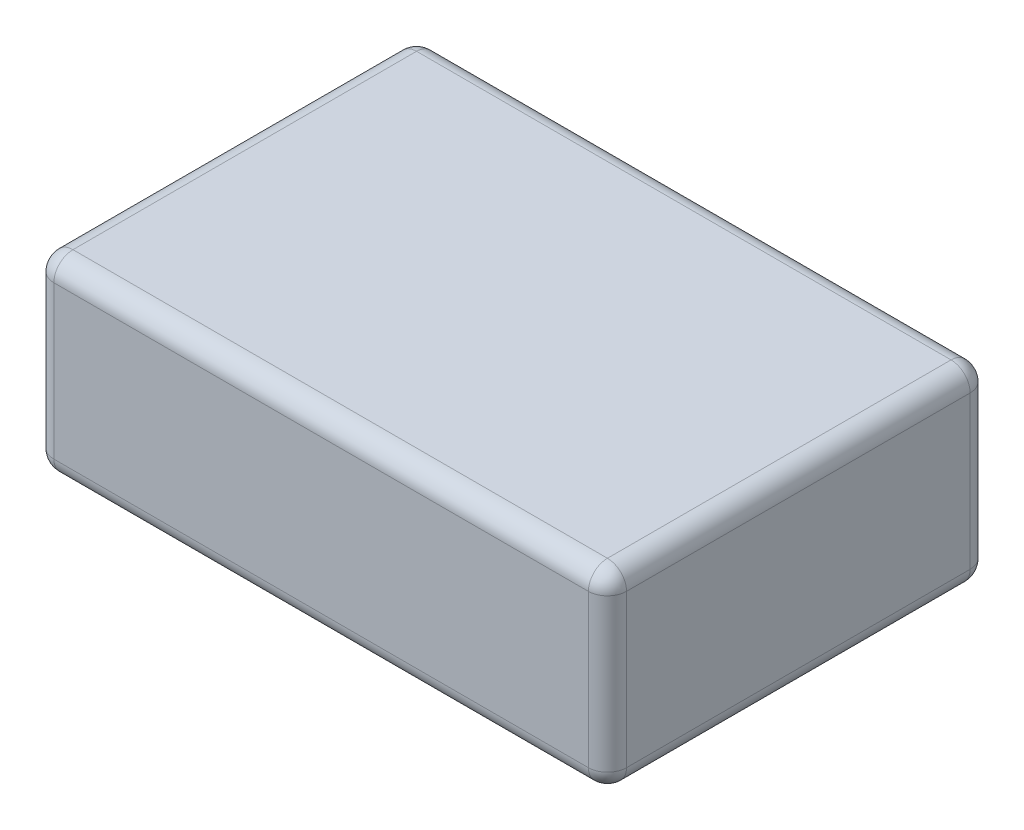
ISO-10303-21;
HEADER;
FILE_DESCRIPTION(('STEP AP214'),'2;1');
FILE_NAME('part.step','',(''),(''),'','','');
FILE_SCHEMA(('AUTOMOTIVE_DESIGN { 1 0 10303 214 1 1 1 1 }'));
ENDSEC;
DATA;
#1=APPLICATION_CONTEXT('core data for automotive mechanical design processes');
#2=APPLICATION_PROTOCOL_DEFINITION('international standard','automotive_design',2000,#1);
#3=PRODUCT_CONTEXT('',#1,'mechanical');
#4=PRODUCT('Part','Part','',(#3));
#5=PRODUCT_RELATED_PRODUCT_CATEGORY('part','',(#4));
#6=PRODUCT_DEFINITION_FORMATION('','',#4);
#7=PRODUCT_DEFINITION_CONTEXT('part definition',#1,'design');
#8=PRODUCT_DEFINITION('design','',#6,#7);
#9=PRODUCT_DEFINITION_SHAPE('','',#8);
#10=(LENGTH_UNIT() NAMED_UNIT(*) SI_UNIT(.MILLI.,.METRE.));
#11=(NAMED_UNIT(*) PLANE_ANGLE_UNIT() SI_UNIT($,.RADIAN.));
#12=(NAMED_UNIT(*) SI_UNIT($,.STERADIAN.) SOLID_ANGLE_UNIT());
#13=UNCERTAINTY_MEASURE_WITH_UNIT(LENGTH_MEASURE(1.E-05),#10,'distance_accuracy_value','');
#14=(GEOMETRIC_REPRESENTATION_CONTEXT(3) GLOBAL_UNCERTAINTY_ASSIGNED_CONTEXT((#13)) GLOBAL_UNIT_ASSIGNED_CONTEXT((#10,
#11,#12)) REPRESENTATION_CONTEXT('',''));
#15=CARTESIAN_POINT('',(0.,0.,0.));
#16=DIRECTION('',(0.,0.,1.));
#17=DIRECTION('',(1.,0.,0.));
#18=AXIS2_PLACEMENT_3D('',#15,#16,#17);
#19=CARTESIAN_POINT('',(15.,5.,-10.));
#20=DIRECTION('',(0.,0.,1.));
#21=DIRECTION('',(1.,0.,0.));
#22=AXIS2_PLACEMENT_3D('',#19,#20,#21);
#23=PLANE('',#22);
#24=DIRECTION('',(-1.,0.,0.));
#25=VECTOR('',#24,1.);
#26=CARTESIAN_POINT('',(15.,4.,-10.));
#27=LINE('',#26,#25);
#28=CARTESIAN_POINT('',(-14.,4.,-10.));
#29=VERTEX_POINT('',#28);
#30=CARTESIAN_POINT('',(14.,4.,-10.));
#31=VERTEX_POINT('',#30);
#32=EDGE_CURVE('E185',#29,#31,#27,.F.);
#33=ORIENTED_EDGE('',*,*,#32,.T.);
#34=DIRECTION('',(0.,1.,0.));
#35=VECTOR('',#34,1.);
#36=CARTESIAN_POINT('',(14.,-5.,-10.));
#37=LINE('',#36,#35);
#38=CARTESIAN_POINT('',(14.,-4.,-10.));
#39=VERTEX_POINT('',#38);
#40=EDGE_CURVE('E139',#31,#39,#37,.F.);
#41=ORIENTED_EDGE('',*,*,#40,.T.);
#42=DIRECTION('',(-1.,0.,0.));
#43=VECTOR('',#42,1.);
#44=CARTESIAN_POINT('',(15.,-4.,-10.));
#45=LINE('',#44,#43);
#46=CARTESIAN_POINT('',(-14.,-4.,-10.));
#47=VERTEX_POINT('',#46);
#48=EDGE_CURVE('E187',#39,#47,#45,.T.);
#49=ORIENTED_EDGE('',*,*,#48,.T.);
#50=DIRECTION('',(0.,1.,0.));
#51=VECTOR('',#50,1.);
#52=CARTESIAN_POINT('',(-14.,5.,-10.));
#53=LINE('',#52,#51);
#54=EDGE_CURVE('E183',#47,#29,#53,.T.);
#55=ORIENTED_EDGE('',*,*,#54,.T.);
#56=EDGE_LOOP('',(#33,#41,#49,#55));
#57=FACE_BOUND('',#56,.T.);
#58=ADVANCED_FACE('F32',(#57),#23,.F.);
#59=CARTESIAN_POINT('',(15.,5.,10.));
#60=DIRECTION('',(0.,-1.,0.));
#61=DIRECTION('',(0.,0.,-1.));
#62=AXIS2_PLACEMENT_3D('',#59,#60,#61);
#63=PLANE('',#62);
#64=DIRECTION('',(0.,0.,1.));
#65=VECTOR('',#64,1.);
#66=CARTESIAN_POINT('',(14.,5.,-10.));
#67=LINE('',#66,#65);
#68=CARTESIAN_POINT('',(14.,5.,9.));
#69=VERTEX_POINT('',#68);
#70=CARTESIAN_POINT('',(14.,5.,-9.));
#71=VERTEX_POINT('',#70);
#72=EDGE_CURVE('E192',#69,#71,#67,.F.);
#73=ORIENTED_EDGE('',*,*,#72,.T.);
#74=DIRECTION('',(-1.,0.,0.));
#75=VECTOR('',#74,1.);
#76=CARTESIAN_POINT('',(15.,5.,-9.));
#77=LINE('',#76,#75);
#78=CARTESIAN_POINT('',(-14.,5.,-9.));
#79=VERTEX_POINT('',#78);
#80=EDGE_CURVE('E196',#71,#79,#77,.T.);
#81=ORIENTED_EDGE('',*,*,#80,.T.);
#82=DIRECTION('',(0.,0.,1.));
#83=VECTOR('',#82,1.);
#84=CARTESIAN_POINT('',(-14.,5.,10.));
#85=LINE('',#84,#83);
#86=CARTESIAN_POINT('',(-14.,5.,9.));
#87=VERTEX_POINT('',#86);
#88=EDGE_CURVE('E194',#79,#87,#85,.T.);
#89=ORIENTED_EDGE('',*,*,#88,.T.);
#90=DIRECTION('',(-1.,0.,0.));
#91=VECTOR('',#90,1.);
#92=CARTESIAN_POINT('',(15.,5.,9.));
#93=LINE('',#92,#91);
#94=EDGE_CURVE('E190',#87,#69,#93,.F.);
#95=ORIENTED_EDGE('',*,*,#94,.T.);
#96=EDGE_LOOP('',(#73,#81,#89,#95));
#97=FACE_BOUND('',#96,.T.);
#98=ADVANCED_FACE('F282',(#97),#63,.F.);
#99=CARTESIAN_POINT('',(15.,5.,10.));
#100=DIRECTION('',(0.,0.,-1.));
#101=DIRECTION('',(0.,1.,0.));
#102=AXIS2_PLACEMENT_3D('',#99,#100,#101);
#103=PLANE('',#102);
#104=DIRECTION('',(-1.,0.,0.));
#105=VECTOR('',#104,1.);
#106=CARTESIAN_POINT('',(15.,-4.,10.));
#107=LINE('',#106,#105);
#108=CARTESIAN_POINT('',(-14.,-4.,10.));
#109=VERTEX_POINT('',#108);
#110=CARTESIAN_POINT('',(14.,-4.,10.));
#111=VERTEX_POINT('',#110);
#112=EDGE_CURVE('E169',#109,#111,#107,.F.);
#113=ORIENTED_EDGE('',*,*,#112,.T.);
#114=DIRECTION('',(0.,-1.,0.));
#115=VECTOR('',#114,1.);
#116=CARTESIAN_POINT('',(14.,5.,10.));
#117=LINE('',#116,#115);
#118=CARTESIAN_POINT('',(14.,4.,10.));
#119=VERTEX_POINT('',#118);
#120=EDGE_CURVE('E171',#111,#119,#117,.F.);
#121=ORIENTED_EDGE('',*,*,#120,.T.);
#122=DIRECTION('',(-1.,0.,0.));
#123=VECTOR('',#122,1.);
#124=CARTESIAN_POINT('',(15.,4.,10.));
#125=LINE('',#124,#123);
#126=CARTESIAN_POINT('',(-14.,4.,10.));
#127=VERTEX_POINT('',#126);
#128=EDGE_CURVE('E165',#119,#127,#125,.T.);
#129=ORIENTED_EDGE('',*,*,#128,.T.);
#130=DIRECTION('',(0.,-1.,0.));
#131=VECTOR('',#130,1.);
#132=CARTESIAN_POINT('',(-14.,5.,10.));
#133=LINE('',#132,#131);
#134=EDGE_CURVE('E167',#127,#109,#133,.T.);
#135=ORIENTED_EDGE('',*,*,#134,.T.);
#136=EDGE_LOOP('',(#113,#121,#129,#135));
#137=FACE_BOUND('',#136,.T.);
#138=ADVANCED_FACE('F288',(#137),#103,.F.);
#139=CARTESIAN_POINT('',(15.,-5.,10.));
#140=DIRECTION('',(0.,1.,0.));
#141=DIRECTION('',(0.,0.,1.));
#142=AXIS2_PLACEMENT_3D('',#139,#140,#141);
#143=PLANE('',#142);
#144=DIRECTION('',(-1.,0.,0.));
#145=VECTOR('',#144,1.);
#146=CARTESIAN_POINT('',(15.,-5.,-9.));
#147=LINE('',#146,#145);
#148=CARTESIAN_POINT('',(-14.,-5.,-9.));
#149=VERTEX_POINT('',#148);
#150=CARTESIAN_POINT('',(14.,-5.,-9.));
#151=VERTEX_POINT('',#150);
#152=EDGE_CURVE('E178',#149,#151,#147,.F.);
#153=ORIENTED_EDGE('',*,*,#152,.T.);
#154=DIRECTION('',(0.,0.,-1.));
#155=VECTOR('',#154,1.);
#156=CARTESIAN_POINT('',(14.,-5.,10.));
#157=LINE('',#156,#155);
#158=CARTESIAN_POINT('',(14.,-5.,9.));
#159=VERTEX_POINT('',#158);
#160=EDGE_CURVE('E180',#151,#159,#157,.F.);
#161=ORIENTED_EDGE('',*,*,#160,.T.);
#162=DIRECTION('',(-1.,0.,0.));
#163=VECTOR('',#162,1.);
#164=CARTESIAN_POINT('',(15.,-5.,9.));
#165=LINE('',#164,#163);
#166=CARTESIAN_POINT('',(-14.,-5.,9.));
#167=VERTEX_POINT('',#166);
#168=EDGE_CURVE('E176',#159,#167,#165,.T.);
#169=ORIENTED_EDGE('',*,*,#168,.T.);
#170=DIRECTION('',(0.,0.,-1.));
#171=VECTOR('',#170,1.);
#172=CARTESIAN_POINT('',(-14.,-5.,10.));
#173=LINE('',#172,#171);
#174=EDGE_CURVE('E174',#167,#149,#173,.T.);
#175=ORIENTED_EDGE('',*,*,#174,.T.);
#176=EDGE_LOOP('',(#153,#161,#169,#175));
#177=FACE_BOUND('',#176,.T.);
#178=ADVANCED_FACE('F265',(#177),#143,.F.);
#179=CARTESIAN_POINT('',(15.,0.,0.));
#180=DIRECTION('',(1.,0.,0.));
#181=DIRECTION('',(0.,0.,-1.));
#182=AXIS2_PLACEMENT_3D('',#179,#180,#181);
#183=PLANE('',#182);
#184=DIRECTION('',(0.,0.,1.));
#185=VECTOR('',#184,1.);
#186=CARTESIAN_POINT('',(15.,4.,10.));
#187=LINE('',#186,#185);
#188=CARTESIAN_POINT('',(15.,4.,-9.));
#189=VERTEX_POINT('',#188);
#190=CARTESIAN_POINT('',(15.,4.,9.));
#191=VERTEX_POINT('',#190);
#192=EDGE_CURVE('E125',#189,#191,#187,.T.);
#193=ORIENTED_EDGE('',*,*,#192,.T.);
#194=DIRECTION('',(0.,-1.,0.));
#195=VECTOR('',#194,1.);
#196=CARTESIAN_POINT('',(15.,-5.,9.));
#197=LINE('',#196,#195);
#198=CARTESIAN_POINT('',(15.,-4.,9.));
#199=VERTEX_POINT('',#198);
#200=EDGE_CURVE('E163',#191,#199,#197,.T.);
#201=ORIENTED_EDGE('',*,*,#200,.T.);
#202=DIRECTION('',(0.,0.,-1.));
#203=VECTOR('',#202,1.);
#204=CARTESIAN_POINT('',(15.,-4.,-10.));
#205=LINE('',#204,#203);
#206=CARTESIAN_POINT('',(15.,-4.,-9.));
#207=VERTEX_POINT('',#206);
#208=EDGE_CURVE('E128',#199,#207,#205,.T.);
#209=ORIENTED_EDGE('',*,*,#208,.T.);
#210=DIRECTION('',(0.,1.,0.));
#211=VECTOR('',#210,1.);
#212=CARTESIAN_POINT('',(15.,5.,-9.));
#213=LINE('',#212,#211);
#214=EDGE_CURVE('E120',#207,#189,#213,.T.);
#215=ORIENTED_EDGE('',*,*,#214,.T.);
#216=EDGE_LOOP('',(#193,#201,#209,#215));
#217=FACE_BOUND('',#216,.T.);
#218=ADVANCED_FACE('F122',(#217),#183,.T.);
#219=CARTESIAN_POINT('',(-15.,0.,0.));
#220=DIRECTION('',(1.,0.,0.));
#221=DIRECTION('',(0.,0.,-1.));
#222=AXIS2_PLACEMENT_3D('',#219,#220,#221);
#223=PLANE('',#222);
#224=DIRECTION('',(0.,1.,0.));
#225=VECTOR('',#224,1.);
#226=CARTESIAN_POINT('',(-15.,0.,-9.));
#227=LINE('',#226,#225);
#228=CARTESIAN_POINT('',(-15.,4.,-9.));
#229=VERTEX_POINT('',#228);
#230=CARTESIAN_POINT('',(-15.,-4.,-9.));
#231=VERTEX_POINT('',#230);
#232=EDGE_CURVE('E41',#229,#231,#227,.F.);
#233=ORIENTED_EDGE('',*,*,#232,.T.);
#234=DIRECTION('',(0.,0.,-1.));
#235=VECTOR('',#234,1.);
#236=CARTESIAN_POINT('',(-15.,-4.,0.));
#237=LINE('',#236,#235);
#238=CARTESIAN_POINT('',(-15.,-4.,9.));
#239=VERTEX_POINT('',#238);
#240=EDGE_CURVE('E11',#231,#239,#237,.F.);
#241=ORIENTED_EDGE('',*,*,#240,.T.);
#242=DIRECTION('',(0.,-1.,0.));
#243=VECTOR('',#242,1.);
#244=CARTESIAN_POINT('',(-15.,0.,9.));
#245=LINE('',#244,#243);
#246=CARTESIAN_POINT('',(-15.,4.,9.));
#247=VERTEX_POINT('',#246);
#248=EDGE_CURVE('E201',#239,#247,#245,.F.);
#249=ORIENTED_EDGE('',*,*,#248,.T.);
#250=DIRECTION('',(0.,0.,1.));
#251=VECTOR('',#250,1.);
#252=CARTESIAN_POINT('',(-15.,4.,0.));
#253=LINE('',#252,#251);
#254=EDGE_CURVE('E199',#247,#229,#253,.F.);
#255=ORIENTED_EDGE('',*,*,#254,.T.);
#256=EDGE_LOOP('',(#233,#241,#249,#255));
#257=FACE_BOUND('',#256,.T.);
#258=ADVANCED_FACE('F358',(#257),#223,.F.);
#259=CARTESIAN_POINT('',(-14.,5.,-9.));
#260=DIRECTION('',(0.,1.,0.));
#261=DIRECTION('',(0.,0.,1.));
#262=AXIS2_PLACEMENT_3D('',#259,#260,#261);
#263=CYLINDRICAL_SURFACE('',#262,1.);
#264=CARTESIAN_POINT('',(-14.,4.,-9.));
#265=DIRECTION('',(0.,1.,0.));
#266=DIRECTION('',(0.,0.,1.));
#267=AXIS2_PLACEMENT_3D('',#264,#265,#266);
#268=CIRCLE('',#267,1.);
#269=EDGE_CURVE('E36',#29,#229,#268,.T.);
#270=ORIENTED_EDGE('',*,*,#269,.F.);
#271=ORIENTED_EDGE('',*,*,#54,.F.);
#272=CARTESIAN_POINT('',(-14.,-4.,-9.));
#273=DIRECTION('',(0.,-1.,0.));
#274=DIRECTION('',(0.,0.,-1.));
#275=AXIS2_PLACEMENT_3D('',#272,#273,#274);
#276=CIRCLE('',#275,1.);
#277=EDGE_CURVE('E160',#231,#47,#276,.T.);
#278=ORIENTED_EDGE('',*,*,#277,.F.);
#279=ORIENTED_EDGE('',*,*,#232,.F.);
#280=EDGE_LOOP('',(#270,#271,#278,#279));
#281=FACE_BOUND('',#280,.T.);
#282=ADVANCED_FACE('F34',(#281),#263,.T.);
#283=CARTESIAN_POINT('',(-14.,4.,-9.));
#284=DIRECTION('',(-1.,0.,0.));
#285=DIRECTION('',(0.,0.,1.));
#286=AXIS2_PLACEMENT_3D('',#283,#284,#285);
#287=SPHERICAL_SURFACE('',#286,1.);
#288=CARTESIAN_POINT('',(-14.,4.,-9.));
#289=DIRECTION('',(-1.,0.,0.));
#290=DIRECTION('',(0.,0.,1.));
#291=AXIS2_PLACEMENT_3D('',#288,#289,#290);
#292=CIRCLE('',#291,1.);
#293=EDGE_CURVE('E245',#29,#79,#292,.F.);
#294=ORIENTED_EDGE('',*,*,#293,.F.);
#295=ORIENTED_EDGE('',*,*,#269,.T.);
#296=CARTESIAN_POINT('',(-14.,4.,-9.));
#297=DIRECTION('',(0.,0.,-1.));
#298=DIRECTION('',(0.,1.,0.));
#299=AXIS2_PLACEMENT_3D('',#296,#297,#298);
#300=CIRCLE('',#299,1.);
#301=EDGE_CURVE('E248',#79,#229,#300,.F.);
#302=ORIENTED_EDGE('',*,*,#301,.F.);
#303=EDGE_LOOP('',(#294,#295,#302));
#304=FACE_BOUND('',#303,.T.);
#305=ADVANCED_FACE('F356',(#304),#287,.T.);
#306=CARTESIAN_POINT('',(-14.,-4.,-9.));
#307=DIRECTION('',(0.,0.,-1.));
#308=DIRECTION('',(0.,1.,0.));
#309=AXIS2_PLACEMENT_3D('',#306,#307,#308);
#310=SPHERICAL_SURFACE('',#309,1.);
#311=CARTESIAN_POINT('',(-14.,-4.,-9.));
#312=DIRECTION('',(0.,0.,-1.));
#313=DIRECTION('',(-1.,0.,0.));
#314=AXIS2_PLACEMENT_3D('',#311,#312,#313);
#315=CIRCLE('',#314,1.);
#316=EDGE_CURVE('E240',#231,#149,#315,.F.);
#317=ORIENTED_EDGE('',*,*,#316,.F.);
#318=ORIENTED_EDGE('',*,*,#277,.T.);
#319=CARTESIAN_POINT('',(-14.,-4.,-9.));
#320=DIRECTION('',(-1.,0.,0.));
#321=DIRECTION('',(0.,0.,1.));
#322=AXIS2_PLACEMENT_3D('',#319,#320,#321);
#323=CIRCLE('',#322,1.);
#324=EDGE_CURVE('E242',#149,#47,#323,.F.);
#325=ORIENTED_EDGE('',*,*,#324,.F.);
#326=EDGE_LOOP('',(#317,#318,#325));
#327=FACE_BOUND('',#326,.T.);
#328=ADVANCED_FACE('F254',(#327),#310,.T.);
#329=CARTESIAN_POINT('',(-14.,4.,10.));
#330=DIRECTION('',(0.,0.,1.));
#331=DIRECTION('',(1.,0.,0.));
#332=AXIS2_PLACEMENT_3D('',#329,#330,#331);
#333=CYLINDRICAL_SURFACE('',#332,1.);
#334=ORIENTED_EDGE('',*,*,#301,.T.);
#335=ORIENTED_EDGE('',*,*,#254,.F.);
#336=CARTESIAN_POINT('',(-14.,4.,9.));
#337=DIRECTION('',(0.,0.,1.));
#338=DIRECTION('',(1.,0.,0.));
#339=AXIS2_PLACEMENT_3D('',#336,#337,#338);
#340=CIRCLE('',#339,1.);
#341=EDGE_CURVE('E234',#87,#247,#340,.T.);
#342=ORIENTED_EDGE('',*,*,#341,.F.);
#343=ORIENTED_EDGE('',*,*,#88,.F.);
#344=EDGE_LOOP('',(#334,#335,#342,#343));
#345=FACE_BOUND('',#344,.T.);
#346=ADVANCED_FACE('F339',(#345),#333,.T.);
#347=CARTESIAN_POINT('',(15.,4.,-9.));
#348=DIRECTION('',(-1.,0.,0.));
#349=DIRECTION('',(0.,0.,1.));
#350=AXIS2_PLACEMENT_3D('',#347,#348,#349);
#351=CYLINDRICAL_SURFACE('',#350,1.);
#352=ORIENTED_EDGE('',*,*,#293,.T.);
#353=ORIENTED_EDGE('',*,*,#80,.F.);
#354=CARTESIAN_POINT('',(14.,4.,-9.));
#355=DIRECTION('',(1.,0.,0.));
#356=DIRECTION('',(0.,0.,-1.));
#357=AXIS2_PLACEMENT_3D('',#354,#355,#356);
#358=CIRCLE('',#357,1.);
#359=EDGE_CURVE('E143',#31,#71,#358,.T.);
#360=ORIENTED_EDGE('',*,*,#359,.F.);
#361=ORIENTED_EDGE('',*,*,#32,.F.);
#362=EDGE_LOOP('',(#352,#353,#360,#361));
#363=FACE_BOUND('',#362,.T.);
#364=ADVANCED_FACE('F352',(#363),#351,.T.);
#365=CARTESIAN_POINT('',(14.,0.,-9.));
#366=DIRECTION('',(0.,-1.,0.));
#367=DIRECTION('',(0.,0.,-1.));
#368=AXIS2_PLACEMENT_3D('',#365,#366,#367);
#369=CYLINDRICAL_SURFACE('',#368,1.);
#370=CARTESIAN_POINT('',(14.,-4.,-9.));
#371=DIRECTION('',(0.,-1.,0.));
#372=DIRECTION('',(1.,0.,0.));
#373=AXIS2_PLACEMENT_3D('',#370,#371,#372);
#374=CIRCLE('',#373,1.);
#375=EDGE_CURVE('E144',#39,#207,#374,.T.);
#376=ORIENTED_EDGE('',*,*,#375,.F.);
#377=ORIENTED_EDGE('',*,*,#40,.F.);
#378=CARTESIAN_POINT('',(14.,4.,-9.));
#379=DIRECTION('',(0.,1.,0.));
#380=DIRECTION('',(0.,0.,1.));
#381=AXIS2_PLACEMENT_3D('',#378,#379,#380);
#382=CIRCLE('',#381,1.);
#383=EDGE_CURVE('E135',#189,#31,#382,.T.);
#384=ORIENTED_EDGE('',*,*,#383,.F.);
#385=ORIENTED_EDGE('',*,*,#214,.F.);
#386=EDGE_LOOP('',(#376,#377,#384,#385));
#387=FACE_BOUND('',#386,.T.);
#388=ADVANCED_FACE('F137',(#387),#369,.T.);
#389=CARTESIAN_POINT('',(15.,-4.,-9.));
#390=DIRECTION('',(-1.,0.,0.));
#391=DIRECTION('',(0.,0.,1.));
#392=AXIS2_PLACEMENT_3D('',#389,#390,#391);
#393=CYLINDRICAL_SURFACE('',#392,1.);
#394=ORIENTED_EDGE('',*,*,#324,.T.);
#395=ORIENTED_EDGE('',*,*,#48,.F.);
#396=CARTESIAN_POINT('',(14.,-4.,-9.));
#397=DIRECTION('',(1.,0.,0.));
#398=DIRECTION('',(0.,0.,-1.));
#399=AXIS2_PLACEMENT_3D('',#396,#397,#398);
#400=CIRCLE('',#399,1.);
#401=EDGE_CURVE('E230',#151,#39,#400,.T.);
#402=ORIENTED_EDGE('',*,*,#401,.F.);
#403=ORIENTED_EDGE('',*,*,#152,.F.);
#404=EDGE_LOOP('',(#394,#395,#402,#403));
#405=FACE_BOUND('',#404,.T.);
#406=ADVANCED_FACE('F261',(#405),#393,.T.);
#407=CARTESIAN_POINT('',(-14.,-4.,10.));
#408=DIRECTION('',(0.,0.,-1.));
#409=DIRECTION('',(-1.,0.,0.));
#410=AXIS2_PLACEMENT_3D('',#407,#408,#409);
#411=CYLINDRICAL_SURFACE('',#410,1.);
#412=ORIENTED_EDGE('',*,*,#316,.T.);
#413=ORIENTED_EDGE('',*,*,#174,.F.);
#414=CARTESIAN_POINT('',(-14.,-4.,9.));
#415=DIRECTION('',(0.,0.,1.));
#416=DIRECTION('',(1.,0.,0.));
#417=AXIS2_PLACEMENT_3D('',#414,#415,#416);
#418=CIRCLE('',#417,1.);
#419=EDGE_CURVE('E227',#239,#167,#418,.T.);
#420=ORIENTED_EDGE('',*,*,#419,.F.);
#421=ORIENTED_EDGE('',*,*,#240,.F.);
#422=EDGE_LOOP('',(#412,#413,#420,#421));
#423=FACE_BOUND('',#422,.T.);
#424=ADVANCED_FACE('F269',(#423),#411,.T.);
#425=CARTESIAN_POINT('',(-14.,5.,9.));
#426=DIRECTION('',(0.,-1.,0.));
#427=DIRECTION('',(0.,0.,-1.));
#428=AXIS2_PLACEMENT_3D('',#425,#426,#427);
#429=CYLINDRICAL_SURFACE('',#428,1.);
#430=CARTESIAN_POINT('',(-14.,4.,9.));
#431=DIRECTION('',(0.,1.,0.));
#432=DIRECTION('',(0.,0.,1.));
#433=AXIS2_PLACEMENT_3D('',#430,#431,#432);
#434=CIRCLE('',#433,1.);
#435=EDGE_CURVE('E237',#247,#127,#434,.T.);
#436=ORIENTED_EDGE('',*,*,#435,.F.);
#437=ORIENTED_EDGE('',*,*,#248,.F.);
#438=CARTESIAN_POINT('',(-14.,-4.,9.));
#439=DIRECTION('',(0.,-1.,0.));
#440=DIRECTION('',(0.,0.,-1.));
#441=AXIS2_PLACEMENT_3D('',#438,#439,#440);
#442=CIRCLE('',#441,1.);
#443=EDGE_CURVE('E224',#109,#239,#442,.T.);
#444=ORIENTED_EDGE('',*,*,#443,.F.);
#445=ORIENTED_EDGE('',*,*,#134,.F.);
#446=EDGE_LOOP('',(#436,#437,#444,#445));
#447=FACE_BOUND('',#446,.T.);
#448=ADVANCED_FACE('F271',(#447),#429,.T.);
#449=CARTESIAN_POINT('',(-14.,4.,9.));
#450=DIRECTION('',(-1.,0.,0.));
#451=DIRECTION('',(0.,0.,1.));
#452=AXIS2_PLACEMENT_3D('',#449,#450,#451);
#453=SPHERICAL_SURFACE('',#452,1.);
#454=ORIENTED_EDGE('',*,*,#341,.T.);
#455=ORIENTED_EDGE('',*,*,#435,.T.);
#456=CARTESIAN_POINT('',(-14.,4.,9.));
#457=DIRECTION('',(-1.,0.,0.));
#458=DIRECTION('',(0.,0.,1.));
#459=AXIS2_PLACEMENT_3D('',#456,#457,#458);
#460=CIRCLE('',#459,1.);
#461=EDGE_CURVE('E151',#87,#127,#460,.F.);
#462=ORIENTED_EDGE('',*,*,#461,.F.);
#463=EDGE_LOOP('',(#454,#455,#462));
#464=FACE_BOUND('',#463,.T.);
#465=ADVANCED_FACE('F277',(#464),#453,.T.);
#466=CARTESIAN_POINT('',(14.,4.,-9.));
#467=DIRECTION('',(0.,0.,-1.));
#468=DIRECTION('',(-1.,0.,0.));
#469=AXIS2_PLACEMENT_3D('',#466,#467,#468);
#470=SPHERICAL_SURFACE('',#469,1.);
#471=ORIENTED_EDGE('',*,*,#383,.T.);
#472=ORIENTED_EDGE('',*,*,#359,.T.);
#473=CARTESIAN_POINT('',(14.,4.,-9.));
#474=DIRECTION('',(0.,0.,-1.));
#475=DIRECTION('',(-1.,0.,0.));
#476=AXIS2_PLACEMENT_3D('',#473,#474,#475);
#477=CIRCLE('',#476,1.);
#478=EDGE_CURVE('E147',#189,#71,#477,.F.);
#479=ORIENTED_EDGE('',*,*,#478,.F.);
#480=EDGE_LOOP('',(#471,#472,#479));
#481=FACE_BOUND('',#480,.T.);
#482=ADVANCED_FACE('F148',(#481),#470,.T.);
#483=CARTESIAN_POINT('',(14.,-4.,-9.));
#484=DIRECTION('',(0.,0.,-1.));
#485=DIRECTION('',(0.,1.,0.));
#486=AXIS2_PLACEMENT_3D('',#483,#484,#485);
#487=SPHERICAL_SURFACE('',#486,1.);
#488=ORIENTED_EDGE('',*,*,#401,.T.);
#489=ORIENTED_EDGE('',*,*,#375,.T.);
#490=CARTESIAN_POINT('',(14.,-4.,-9.));
#491=DIRECTION('',(0.,0.,-1.));
#492=DIRECTION('',(-1.,0.,0.));
#493=AXIS2_PLACEMENT_3D('',#490,#491,#492);
#494=CIRCLE('',#493,1.);
#495=EDGE_CURVE('E152',#151,#207,#494,.F.);
#496=ORIENTED_EDGE('',*,*,#495,.F.);
#497=EDGE_LOOP('',(#488,#489,#496));
#498=FACE_BOUND('',#497,.T.);
#499=ADVANCED_FACE('F322',(#498),#487,.T.);
#500=CARTESIAN_POINT('',(-14.,-4.,9.));
#501=DIRECTION('',(-1.,0.,0.));
#502=DIRECTION('',(0.,0.,1.));
#503=AXIS2_PLACEMENT_3D('',#500,#501,#502);
#504=SPHERICAL_SURFACE('',#503,1.);
#505=ORIENTED_EDGE('',*,*,#443,.T.);
#506=ORIENTED_EDGE('',*,*,#419,.T.);
#507=CARTESIAN_POINT('',(-14.,-4.,9.));
#508=DIRECTION('',(-1.,0.,0.));
#509=DIRECTION('',(0.,0.,1.));
#510=AXIS2_PLACEMENT_3D('',#507,#508,#509);
#511=CIRCLE('',#510,1.);
#512=EDGE_CURVE('E217',#109,#167,#511,.F.);
#513=ORIENTED_EDGE('',*,*,#512,.F.);
#514=EDGE_LOOP('',(#505,#506,#513));
#515=FACE_BOUND('',#514,.T.);
#516=ADVANCED_FACE('F318',(#515),#504,.T.);
#517=CARTESIAN_POINT('',(15.,4.,9.));
#518=DIRECTION('',(-1.,0.,0.));
#519=DIRECTION('',(0.,0.,1.));
#520=AXIS2_PLACEMENT_3D('',#517,#518,#519);
#521=CYLINDRICAL_SURFACE('',#520,1.);
#522=ORIENTED_EDGE('',*,*,#461,.T.);
#523=ORIENTED_EDGE('',*,*,#128,.F.);
#524=CARTESIAN_POINT('',(14.,4.,9.));
#525=DIRECTION('',(1.,0.,0.));
#526=DIRECTION('',(0.,0.,-1.));
#527=AXIS2_PLACEMENT_3D('',#524,#525,#526);
#528=CIRCLE('',#527,1.);
#529=EDGE_CURVE('E214',#69,#119,#528,.T.);
#530=ORIENTED_EDGE('',*,*,#529,.F.);
#531=ORIENTED_EDGE('',*,*,#94,.F.);
#532=EDGE_LOOP('',(#522,#523,#530,#531));
#533=FACE_BOUND('',#532,.T.);
#534=ADVANCED_FACE('F315',(#533),#521,.T.);
#535=CARTESIAN_POINT('',(14.,4.,0.));
#536=DIRECTION('',(0.,0.,-1.));
#537=DIRECTION('',(-1.,0.,0.));
#538=AXIS2_PLACEMENT_3D('',#535,#536,#537);
#539=CYLINDRICAL_SURFACE('',#538,1.);
#540=ORIENTED_EDGE('',*,*,#478,.T.);
#541=ORIENTED_EDGE('',*,*,#72,.F.);
#542=CARTESIAN_POINT('',(14.,4.,9.));
#543=DIRECTION('',(0.,0.,1.));
#544=DIRECTION('',(1.,0.,0.));
#545=AXIS2_PLACEMENT_3D('',#542,#543,#544);
#546=CIRCLE('',#545,1.);
#547=EDGE_CURVE('E156',#191,#69,#546,.T.);
#548=ORIENTED_EDGE('',*,*,#547,.F.);
#549=ORIENTED_EDGE('',*,*,#192,.F.);
#550=EDGE_LOOP('',(#540,#541,#548,#549));
#551=FACE_BOUND('',#550,.T.);
#552=ADVANCED_FACE('F154',(#551),#539,.T.);
#553=CARTESIAN_POINT('',(14.,-4.,0.));
#554=DIRECTION('',(0.,0.,1.));
#555=DIRECTION('',(1.,0.,0.));
#556=AXIS2_PLACEMENT_3D('',#553,#554,#555);
#557=CYLINDRICAL_SURFACE('',#556,1.);
#558=ORIENTED_EDGE('',*,*,#495,.T.);
#559=ORIENTED_EDGE('',*,*,#208,.F.);
#560=CARTESIAN_POINT('',(14.,-4.,9.));
#561=DIRECTION('',(0.,0.,1.));
#562=DIRECTION('',(1.,0.,0.));
#563=AXIS2_PLACEMENT_3D('',#560,#561,#562);
#564=CIRCLE('',#563,1.);
#565=EDGE_CURVE('E210',#159,#199,#564,.T.);
#566=ORIENTED_EDGE('',*,*,#565,.F.);
#567=ORIENTED_EDGE('',*,*,#160,.F.);
#568=EDGE_LOOP('',(#558,#559,#566,#567));
#569=FACE_BOUND('',#568,.T.);
#570=ADVANCED_FACE('F308',(#569),#557,.T.);
#571=CARTESIAN_POINT('',(15.,-4.,9.));
#572=DIRECTION('',(-1.,0.,0.));
#573=DIRECTION('',(0.,0.,1.));
#574=AXIS2_PLACEMENT_3D('',#571,#572,#573);
#575=CYLINDRICAL_SURFACE('',#574,1.);
#576=ORIENTED_EDGE('',*,*,#512,.T.);
#577=ORIENTED_EDGE('',*,*,#168,.F.);
#578=CARTESIAN_POINT('',(14.,-4.,9.));
#579=DIRECTION('',(1.,0.,0.));
#580=DIRECTION('',(0.,0.,-1.));
#581=AXIS2_PLACEMENT_3D('',#578,#579,#580);
#582=CIRCLE('',#581,1.);
#583=EDGE_CURVE('E208',#111,#159,#582,.T.);
#584=ORIENTED_EDGE('',*,*,#583,.F.);
#585=ORIENTED_EDGE('',*,*,#112,.F.);
#586=EDGE_LOOP('',(#576,#577,#584,#585));
#587=FACE_BOUND('',#586,.T.);
#588=ADVANCED_FACE('F304',(#587),#575,.T.);
#589=CARTESIAN_POINT('',(14.,4.,9.));
#590=DIRECTION('',(0.,1.,0.));
#591=DIRECTION('',(0.,0.,1.));
#592=AXIS2_PLACEMENT_3D('',#589,#590,#591);
#593=SPHERICAL_SURFACE('',#592,1.);
#594=ORIENTED_EDGE('',*,*,#547,.T.);
#595=ORIENTED_EDGE('',*,*,#529,.T.);
#596=CARTESIAN_POINT('',(14.,4.,9.));
#597=DIRECTION('',(0.,1.,0.));
#598=DIRECTION('',(0.,0.,1.));
#599=AXIS2_PLACEMENT_3D('',#596,#597,#598);
#600=CIRCLE('',#599,1.);
#601=EDGE_CURVE('E206',#191,#119,#600,.F.);
#602=ORIENTED_EDGE('',*,*,#601,.F.);
#603=EDGE_LOOP('',(#594,#595,#602));
#604=FACE_BOUND('',#603,.T.);
#605=ADVANCED_FACE('F300',(#604),#593,.T.);
#606=CARTESIAN_POINT('',(14.,-4.,9.));
#607=DIRECTION('',(0.,-1.,0.));
#608=DIRECTION('',(0.,0.,-1.));
#609=AXIS2_PLACEMENT_3D('',#606,#607,#608);
#610=SPHERICAL_SURFACE('',#609,1.);
#611=ORIENTED_EDGE('',*,*,#583,.T.);
#612=ORIENTED_EDGE('',*,*,#565,.T.);
#613=CARTESIAN_POINT('',(14.,-4.,9.));
#614=DIRECTION('',(0.,-1.,0.));
#615=DIRECTION('',(0.,0.,-1.));
#616=AXIS2_PLACEMENT_3D('',#613,#614,#615);
#617=CIRCLE('',#616,1.);
#618=EDGE_CURVE('E204',#111,#199,#617,.F.);
#619=ORIENTED_EDGE('',*,*,#618,.F.);
#620=EDGE_LOOP('',(#611,#612,#619));
#621=FACE_BOUND('',#620,.T.);
#622=ADVANCED_FACE('F296',(#621),#610,.T.);
#623=CARTESIAN_POINT('',(14.,0.,9.));
#624=DIRECTION('',(0.,1.,0.));
#625=DIRECTION('',(0.,0.,1.));
#626=AXIS2_PLACEMENT_3D('',#623,#624,#625);
#627=CYLINDRICAL_SURFACE('',#626,1.);
#628=ORIENTED_EDGE('',*,*,#601,.T.);
#629=ORIENTED_EDGE('',*,*,#120,.F.);
#630=ORIENTED_EDGE('',*,*,#618,.T.);
#631=ORIENTED_EDGE('',*,*,#200,.F.);
#632=EDGE_LOOP('',(#628,#629,#630,#631));
#633=FACE_BOUND('',#632,.T.);
#634=ADVANCED_FACE('F293',(#633),#627,.T.);
#635=CLOSED_SHELL('',(#58,#98,#138,#178,#218,#258,#282,#305,#328,#346,#364,#388,#406,#424,#448,
#465,#482,#499,#516,#534,#552,#570,#588,#605,#622,#634));
#636=MANIFOLD_SOLID_BREP('B2',#635);
#637=ADVANCED_BREP_SHAPE_REPRESENTATION('',(#18,#636),#14);
#638=SHAPE_DEFINITION_REPRESENTATION(#9,#637);
ENDSEC;
END-ISO-10303-21;
